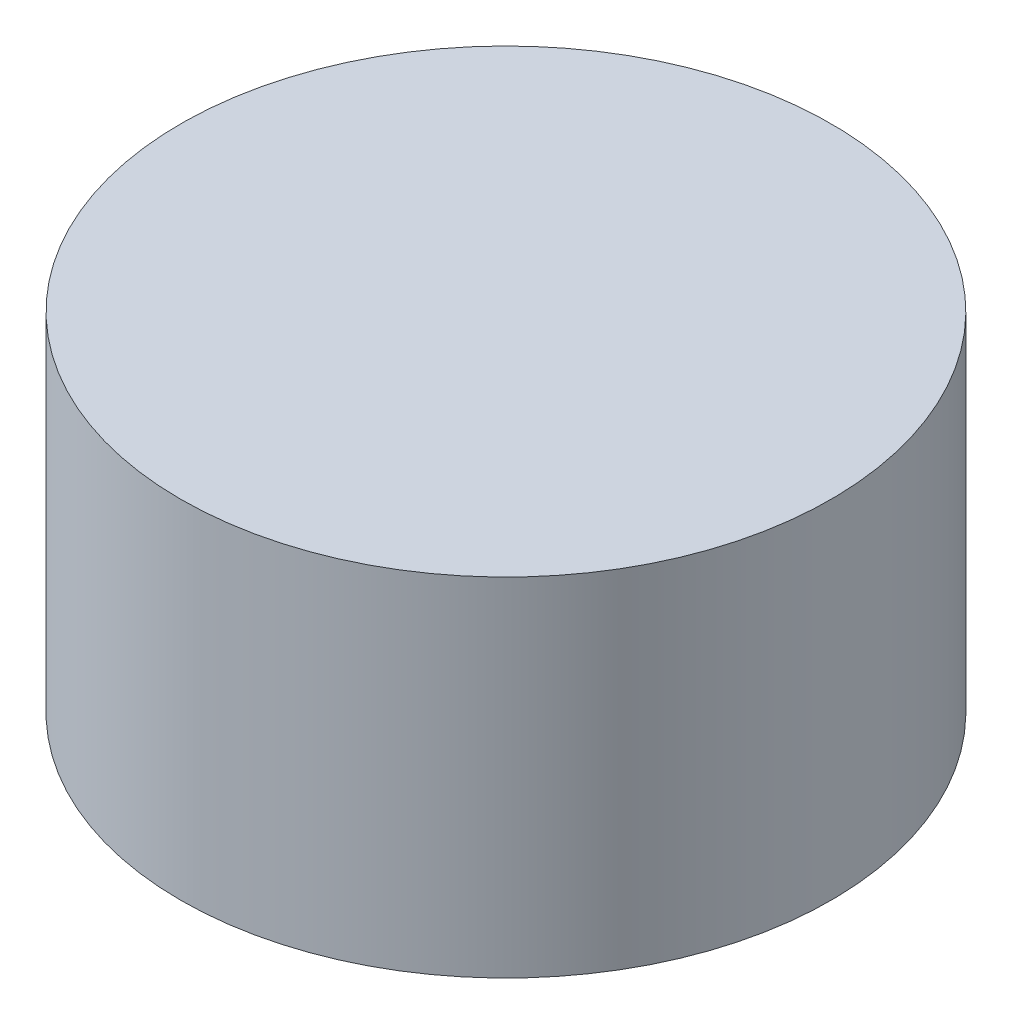
ISO-10303-21;
HEADER;
FILE_DESCRIPTION(('STEP AP214'),'2;1');
FILE_NAME('part.step','',(''),(''),'','','');
FILE_SCHEMA(('AUTOMOTIVE_DESIGN { 1 0 10303 214 1 1 1 1 }'));
ENDSEC;
DATA;
#1=APPLICATION_CONTEXT('core data for automotive mechanical design processes');
#2=APPLICATION_PROTOCOL_DEFINITION('international standard','automotive_design',2000,#1);
#3=PRODUCT_CONTEXT('',#1,'mechanical');
#4=PRODUCT('Part','Part','',(#3));
#5=PRODUCT_RELATED_PRODUCT_CATEGORY('part','',(#4));
#6=PRODUCT_DEFINITION_FORMATION('','',#4);
#7=PRODUCT_DEFINITION_CONTEXT('part definition',#1,'design');
#8=PRODUCT_DEFINITION('design','',#6,#7);
#9=PRODUCT_DEFINITION_SHAPE('','',#8);
#10=(LENGTH_UNIT() NAMED_UNIT(*) SI_UNIT(.MILLI.,.METRE.));
#11=(NAMED_UNIT(*) PLANE_ANGLE_UNIT() SI_UNIT($,.RADIAN.));
#12=(NAMED_UNIT(*) SI_UNIT($,.STERADIAN.) SOLID_ANGLE_UNIT());
#13=UNCERTAINTY_MEASURE_WITH_UNIT(LENGTH_MEASURE(1.E-05),#10,'distance_accuracy_value','');
#14=(GEOMETRIC_REPRESENTATION_CONTEXT(3) GLOBAL_UNCERTAINTY_ASSIGNED_CONTEXT((#13)) GLOBAL_UNIT_ASSIGNED_CONTEXT((#10,
#11,#12)) REPRESENTATION_CONTEXT('',''));
#15=CARTESIAN_POINT('',(0.,0.,0.));
#16=DIRECTION('',(0.,0.,1.));
#17=DIRECTION('',(1.,0.,0.));
#18=AXIS2_PLACEMENT_3D('',#15,#16,#17);
#19=CARTESIAN_POINT('',(0.,5.8928,0.));
#20=DIRECTION('',(0.,-1.,0.));
#21=DIRECTION('',(0.,0.,-1.));
#22=AXIS2_PLACEMENT_3D('',#19,#20,#21);
#23=CYLINDRICAL_SURFACE('',#22,11.0363);
#24=CARTESIAN_POINT('',(0.,5.8928,0.));
#25=DIRECTION('',(0.,1.,0.));
#26=DIRECTION('',(0.,0.,1.));
#27=AXIS2_PLACEMENT_3D('',#24,#25,#26);
#28=CIRCLE('',#27,11.0363);
#29=CARTESIAN_POINT('',(0.,5.8928,11.0363));
#30=VERTEX_POINT('',#29);
#31=EDGE_CURVE('E10',#30,#30,#28,.T.);
#32=ORIENTED_EDGE('',*,*,#31,.F.);
#33=EDGE_LOOP('',(#32));
#34=FACE_BOUND('',#33,.T.);
#35=CARTESIAN_POINT('',(0.,-5.8928,0.));
#36=DIRECTION('',(0.,1.,0.));
#37=DIRECTION('',(0.,0.,1.));
#38=AXIS2_PLACEMENT_3D('',#35,#36,#37);
#39=CIRCLE('',#38,11.0363);
#40=CARTESIAN_POINT('',(0.,-5.8928,11.0363));
#41=VERTEX_POINT('',#40);
#42=EDGE_CURVE('E35',#41,#41,#39,.T.);
#43=ORIENTED_EDGE('',*,*,#42,.T.);
#44=EDGE_LOOP('',(#43));
#45=FACE_BOUND('',#44,.T.);
#46=ADVANCED_FACE('F32',(#34,#45),#23,.T.);
#47=CARTESIAN_POINT('',(0.,5.8928,0.));
#48=DIRECTION('',(0.,1.,0.));
#49=DIRECTION('',(0.,0.,1.));
#50=AXIS2_PLACEMENT_3D('',#47,#48,#49);
#51=PLANE('',#50);
#52=ORIENTED_EDGE('',*,*,#31,.T.);
#53=EDGE_LOOP('',(#52));
#54=FACE_BOUND('',#53,.T.);
#55=ADVANCED_FACE('F47',(#54),#51,.T.);
#56=CARTESIAN_POINT('',(0.,-5.8928,0.));
#57=DIRECTION('',(0.,1.,0.));
#58=DIRECTION('',(0.,0.,1.));
#59=AXIS2_PLACEMENT_3D('',#56,#57,#58);
#60=PLANE('',#59);
#61=ORIENTED_EDGE('',*,*,#42,.F.);
#62=EDGE_LOOP('',(#61));
#63=FACE_BOUND('',#62,.T.);
#64=ADVANCED_FACE('F45',(#63),#60,.F.);
#65=CLOSED_SHELL('',(#46,#55,#64));
#66=MANIFOLD_SOLID_BREP('B2',#65);
#67=ADVANCED_BREP_SHAPE_REPRESENTATION('',(#18,#66),#14);
#68=SHAPE_DEFINITION_REPRESENTATION(#9,#67);
ENDSEC;
END-ISO-10303-21;
